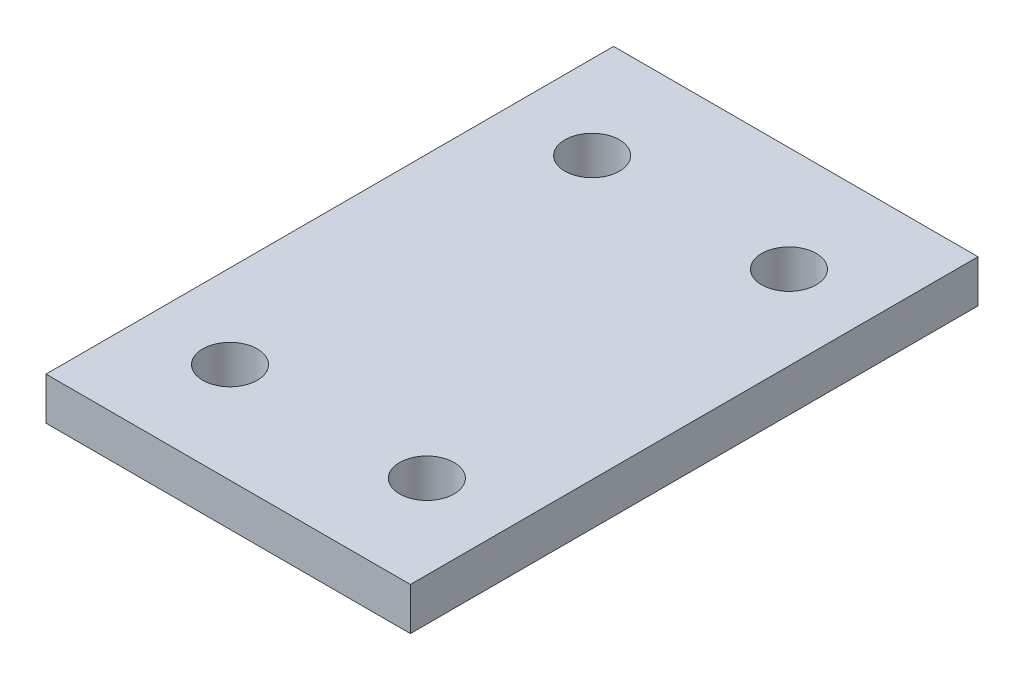
ISO-10303-21;
HEADER;
FILE_DESCRIPTION(('STEP AP214'),'2;1');
FILE_NAME('part.step','',(''),(''),'','','');
FILE_SCHEMA(('AUTOMOTIVE_DESIGN { 1 0 10303 214 1 1 1 1 }'));
ENDSEC;
DATA;
#1=APPLICATION_CONTEXT('core data for automotive mechanical design processes');
#2=APPLICATION_PROTOCOL_DEFINITION('international standard','automotive_design',2000,#1);
#3=PRODUCT_CONTEXT('',#1,'mechanical');
#4=PRODUCT('Part','Part','',(#3));
#5=PRODUCT_RELATED_PRODUCT_CATEGORY('part','',(#4));
#6=PRODUCT_DEFINITION_FORMATION('','',#4);
#7=PRODUCT_DEFINITION_CONTEXT('part definition',#1,'design');
#8=PRODUCT_DEFINITION('design','',#6,#7);
#9=PRODUCT_DEFINITION_SHAPE('','',#8);
#10=(LENGTH_UNIT() NAMED_UNIT(*) SI_UNIT(.MILLI.,.METRE.));
#11=(NAMED_UNIT(*) PLANE_ANGLE_UNIT() SI_UNIT($,.RADIAN.));
#12=(NAMED_UNIT(*) SI_UNIT($,.STERADIAN.) SOLID_ANGLE_UNIT());
#13=UNCERTAINTY_MEASURE_WITH_UNIT(LENGTH_MEASURE(1.E-05),#10,'distance_accuracy_value','');
#14=(GEOMETRIC_REPRESENTATION_CONTEXT(3) GLOBAL_UNCERTAINTY_ASSIGNED_CONTEXT((#13)) GLOBAL_UNIT_ASSIGNED_CONTEXT((#10,
#11,#12)) REPRESENTATION_CONTEXT('',''));
#15=CARTESIAN_POINT('',(0.,0.,0.));
#16=DIRECTION('',(0.,0.,1.));
#17=DIRECTION('',(1.,0.,0.));
#18=AXIS2_PLACEMENT_3D('',#15,#16,#17);
#19=CARTESIAN_POINT('',(20.3835,4.7625,-31.75));
#20=DIRECTION('',(0.,-1.,0.));
#21=DIRECTION('',(0.,0.,-1.));
#22=AXIS2_PLACEMENT_3D('',#19,#20,#21);
#23=PLANE('',#22);
#24=CARTESIAN_POINT('',(-11.0109,4.7625,20.5359000000001));
#25=DIRECTION('',(0.,1.,0.));
#26=DIRECTION('',(0.,0.,-1.));
#27=AXIS2_PLACEMENT_3D('',#24,#25,#26);
#28=CIRCLE('',#27,3.05);
#29=CARTESIAN_POINT('',(-11.0109,4.7625,17.4859));
#30=VERTEX_POINT('',#29);
#31=EDGE_CURVE('E121',#30,#30,#28,.T.);
#32=ORIENTED_EDGE('',*,*,#31,.F.);
#33=EDGE_LOOP('',(#32));
#34=FACE_BOUND('',#33,.T.);
#35=CARTESIAN_POINT('',(11.0109,4.7625,-19.9771));
#36=DIRECTION('',(0.,1.,0.));
#37=DIRECTION('',(0.,0.,1.));
#38=AXIS2_PLACEMENT_3D('',#35,#36,#37);
#39=CIRCLE('',#38,3.05);
#40=CARTESIAN_POINT('',(11.0109,4.7625,-23.0271));
#41=VERTEX_POINT('',#40);
#42=EDGE_CURVE('E100',#41,#41,#39,.T.);
#43=ORIENTED_EDGE('',*,*,#42,.F.);
#44=EDGE_LOOP('',(#43));
#45=FACE_BOUND('',#44,.T.);
#46=DIRECTION('',(0.,0.,-1.));
#47=VECTOR('',#46,1.);
#48=CARTESIAN_POINT('',(20.3835,4.7625,31.75));
#49=LINE('',#48,#47);
#50=CARTESIAN_POINT('',(20.3835,4.7625,31.75));
#51=VERTEX_POINT('',#50);
#52=CARTESIAN_POINT('',(20.3835,4.7625,-31.75));
#53=VERTEX_POINT('',#52);
#54=EDGE_CURVE('E85',#51,#53,#49,.T.);
#55=ORIENTED_EDGE('',*,*,#54,.T.);
#56=DIRECTION('',(-1.,0.,0.));
#57=VECTOR('',#56,1.);
#58=CARTESIAN_POINT('',(-20.3835,4.7625,-31.75));
#59=LINE('',#58,#57);
#60=CARTESIAN_POINT('',(-20.3835,4.7625,-31.75));
#61=VERTEX_POINT('',#60);
#62=EDGE_CURVE('E80',#53,#61,#59,.T.);
#63=ORIENTED_EDGE('',*,*,#62,.T.);
#64=DIRECTION('',(0.,0.,1.));
#65=VECTOR('',#64,1.);
#66=CARTESIAN_POINT('',(-20.3835,4.7625,31.75));
#67=LINE('',#66,#65);
#68=CARTESIAN_POINT('',(-20.3835,4.7625,31.75));
#69=VERTEX_POINT('',#68);
#70=EDGE_CURVE('E83',#61,#69,#67,.T.);
#71=ORIENTED_EDGE('',*,*,#70,.T.);
#72=DIRECTION('',(1.,0.,0.));
#73=VECTOR('',#72,1.);
#74=CARTESIAN_POINT('',(-20.3835,4.7625,31.75));
#75=LINE('',#74,#73);
#76=EDGE_CURVE('E50',#69,#51,#75,.T.);
#77=ORIENTED_EDGE('',*,*,#76,.T.);
#78=EDGE_LOOP('',(#55,#63,#71,#77));
#79=FACE_BOUND('',#78,.T.);
#80=CARTESIAN_POINT('',(11.0109,4.7625,20.5359000000001));
#81=DIRECTION('',(0.,1.,0.));
#82=DIRECTION('',(0.,0.,1.));
#83=AXIS2_PLACEMENT_3D('',#80,#81,#82);
#84=CIRCLE('',#83,3.05);
#85=CARTESIAN_POINT('',(11.0109,4.7625,17.4859));
#86=VERTEX_POINT('',#85);
#87=EDGE_CURVE('E115',#86,#86,#84,.T.);
#88=ORIENTED_EDGE('',*,*,#87,.F.);
#89=EDGE_LOOP('',(#88));
#90=FACE_BOUND('',#89,.T.);
#91=CARTESIAN_POINT('',(-11.0109,4.7625,-19.9771));
#92=DIRECTION('',(0.,1.,0.));
#93=DIRECTION('',(0.,0.,-1.));
#94=AXIS2_PLACEMENT_3D('',#91,#92,#93);
#95=CIRCLE('',#94,3.05);
#96=CARTESIAN_POINT('',(-11.0109,4.7625,-23.0271));
#97=VERTEX_POINT('',#96);
#98=EDGE_CURVE('E127',#97,#97,#95,.T.);
#99=ORIENTED_EDGE('',*,*,#98,.F.);
#100=EDGE_LOOP('',(#99));
#101=FACE_BOUND('',#100,.T.);
#102=ADVANCED_FACE('F33',(#34,#45,#79,#90,#101),#23,.F.);
#103=CARTESIAN_POINT('',(20.3835,0.,-31.75));
#104=DIRECTION('',(0.,-1.,0.));
#105=DIRECTION('',(0.,0.,-1.));
#106=AXIS2_PLACEMENT_3D('',#103,#104,#105);
#107=PLANE('',#106);
#108=CARTESIAN_POINT('',(-11.0109,0.,20.5359000000001));
#109=DIRECTION('',(0.,1.,0.));
#110=DIRECTION('',(0.,0.,-1.));
#111=AXIS2_PLACEMENT_3D('',#108,#109,#110);
#112=CIRCLE('',#111,3.05);
#113=CARTESIAN_POINT('',(-11.0109,0.,17.4859));
#114=VERTEX_POINT('',#113);
#115=EDGE_CURVE('E124',#114,#114,#112,.T.);
#116=ORIENTED_EDGE('',*,*,#115,.T.);
#117=EDGE_LOOP('',(#116));
#118=FACE_BOUND('',#117,.T.);
#119=CARTESIAN_POINT('',(11.0109,0.,-19.9771));
#120=DIRECTION('',(0.,1.,0.));
#121=DIRECTION('',(0.,0.,1.));
#122=AXIS2_PLACEMENT_3D('',#119,#120,#121);
#123=CIRCLE('',#122,3.05);
#124=CARTESIAN_POINT('',(11.0109,0.,-23.0271));
#125=VERTEX_POINT('',#124);
#126=EDGE_CURVE('E112',#125,#125,#123,.T.);
#127=ORIENTED_EDGE('',*,*,#126,.T.);
#128=EDGE_LOOP('',(#127));
#129=FACE_BOUND('',#128,.T.);
#130=DIRECTION('',(0.,0.,-1.));
#131=VECTOR('',#130,1.);
#132=CARTESIAN_POINT('',(20.3835,0.,31.75));
#133=LINE('',#132,#131);
#134=CARTESIAN_POINT('',(20.3835,0.,31.75));
#135=VERTEX_POINT('',#134);
#136=CARTESIAN_POINT('',(20.3835,0.,-31.75));
#137=VERTEX_POINT('',#136);
#138=EDGE_CURVE('E97',#135,#137,#133,.T.);
#139=ORIENTED_EDGE('',*,*,#138,.F.);
#140=DIRECTION('',(1.,0.,0.));
#141=VECTOR('',#140,1.);
#142=CARTESIAN_POINT('',(-20.3835,0.,31.75));
#143=LINE('',#142,#141);
#144=CARTESIAN_POINT('',(-20.3835,0.,31.75));
#145=VERTEX_POINT('',#144);
#146=EDGE_CURVE('E73',#145,#135,#143,.T.);
#147=ORIENTED_EDGE('',*,*,#146,.F.);
#148=DIRECTION('',(0.,0.,1.));
#149=VECTOR('',#148,1.);
#150=CARTESIAN_POINT('',(-20.3835,0.,31.75));
#151=LINE('',#150,#149);
#152=CARTESIAN_POINT('',(-20.3835,0.,-31.75));
#153=VERTEX_POINT('',#152);
#154=EDGE_CURVE('E67',#153,#145,#151,.T.);
#155=ORIENTED_EDGE('',*,*,#154,.F.);
#156=DIRECTION('',(-1.,0.,0.));
#157=VECTOR('',#156,1.);
#158=CARTESIAN_POINT('',(-20.3835,0.,-31.75));
#159=LINE('',#158,#157);
#160=EDGE_CURVE('E89',#137,#153,#159,.T.);
#161=ORIENTED_EDGE('',*,*,#160,.F.);
#162=EDGE_LOOP('',(#139,#147,#155,#161));
#163=FACE_BOUND('',#162,.T.);
#164=CARTESIAN_POINT('',(11.0109,0.,20.5359000000001));
#165=DIRECTION('',(0.,1.,0.));
#166=DIRECTION('',(0.,0.,1.));
#167=AXIS2_PLACEMENT_3D('',#164,#165,#166);
#168=CIRCLE('',#167,3.05);
#169=CARTESIAN_POINT('',(11.0109,0.,17.4859));
#170=VERTEX_POINT('',#169);
#171=EDGE_CURVE('E118',#170,#170,#168,.T.);
#172=ORIENTED_EDGE('',*,*,#171,.T.);
#173=EDGE_LOOP('',(#172));
#174=FACE_BOUND('',#173,.T.);
#175=CARTESIAN_POINT('',(-11.0109,0.,-19.9771));
#176=DIRECTION('',(0.,1.,0.));
#177=DIRECTION('',(0.,0.,-1.));
#178=AXIS2_PLACEMENT_3D('',#175,#176,#177);
#179=CIRCLE('',#178,3.05);
#180=CARTESIAN_POINT('',(-11.0109,0.,-23.0271));
#181=VERTEX_POINT('',#180);
#182=EDGE_CURVE('E130',#181,#181,#179,.T.);
#183=ORIENTED_EDGE('',*,*,#182,.T.);
#184=EDGE_LOOP('',(#183));
#185=FACE_BOUND('',#184,.T.);
#186=ADVANCED_FACE('F108',(#118,#129,#163,#174,#185),#107,.T.);
#187=CARTESIAN_POINT('',(20.3835,4.7625,31.75));
#188=DIRECTION('',(-1.,0.,0.));
#189=DIRECTION('',(0.,0.,1.));
#190=AXIS2_PLACEMENT_3D('',#187,#188,#189);
#191=PLANE('',#190);
#192=ORIENTED_EDGE('',*,*,#138,.T.);
#193=DIRECTION('',(0.,-1.,0.));
#194=VECTOR('',#193,1.);
#195=CARTESIAN_POINT('',(20.3835,4.7625,-31.75));
#196=LINE('',#195,#194);
#197=EDGE_CURVE('E11',#53,#137,#196,.T.);
#198=ORIENTED_EDGE('',*,*,#197,.F.);
#199=ORIENTED_EDGE('',*,*,#54,.F.);
#200=DIRECTION('',(0.,-1.,0.));
#201=VECTOR('',#200,1.);
#202=CARTESIAN_POINT('',(20.3835,4.7625,31.75));
#203=LINE('',#202,#201);
#204=EDGE_CURVE('E93',#51,#135,#203,.T.);
#205=ORIENTED_EDGE('',*,*,#204,.T.);
#206=EDGE_LOOP('',(#192,#198,#199,#205));
#207=FACE_BOUND('',#206,.T.);
#208=ADVANCED_FACE('F35',(#207),#191,.F.);
#209=CARTESIAN_POINT('',(-20.3835,4.7625,-31.75));
#210=DIRECTION('',(0.,0.,1.));
#211=DIRECTION('',(1.,0.,0.));
#212=AXIS2_PLACEMENT_3D('',#209,#210,#211);
#213=PLANE('',#212);
#214=ORIENTED_EDGE('',*,*,#160,.T.);
#215=DIRECTION('',(0.,-1.,0.));
#216=VECTOR('',#215,1.);
#217=CARTESIAN_POINT('',(-20.3835,4.7625,-31.75));
#218=LINE('',#217,#216);
#219=EDGE_CURVE('E42',#61,#153,#218,.T.);
#220=ORIENTED_EDGE('',*,*,#219,.F.);
#221=ORIENTED_EDGE('',*,*,#62,.F.);
#222=ORIENTED_EDGE('',*,*,#197,.T.);
#223=EDGE_LOOP('',(#214,#220,#221,#222));
#224=FACE_BOUND('',#223,.T.);
#225=ADVANCED_FACE('F88',(#224),#213,.F.);
#226=CARTESIAN_POINT('',(-20.3835,4.7625,31.75));
#227=DIRECTION('',(1.,0.,0.));
#228=DIRECTION('',(0.,0.,-1.));
#229=AXIS2_PLACEMENT_3D('',#226,#227,#228);
#230=PLANE('',#229);
#231=ORIENTED_EDGE('',*,*,#154,.T.);
#232=DIRECTION('',(0.,-1.,0.));
#233=VECTOR('',#232,1.);
#234=CARTESIAN_POINT('',(-20.3835,4.7625,31.75));
#235=LINE('',#234,#233);
#236=EDGE_CURVE('E90',#69,#145,#235,.T.);
#237=ORIENTED_EDGE('',*,*,#236,.F.);
#238=ORIENTED_EDGE('',*,*,#70,.F.);
#239=ORIENTED_EDGE('',*,*,#219,.T.);
#240=EDGE_LOOP('',(#231,#237,#238,#239));
#241=FACE_BOUND('',#240,.T.);
#242=ADVANCED_FACE('F91',(#241),#230,.F.);
#243=CARTESIAN_POINT('',(-20.3835,4.7625,31.75));
#244=DIRECTION('',(0.,0.,-1.));
#245=DIRECTION('',(-1.,0.,0.));
#246=AXIS2_PLACEMENT_3D('',#243,#244,#245);
#247=PLANE('',#246);
#248=ORIENTED_EDGE('',*,*,#146,.T.);
#249=ORIENTED_EDGE('',*,*,#204,.F.);
#250=ORIENTED_EDGE('',*,*,#76,.F.);
#251=ORIENTED_EDGE('',*,*,#236,.T.);
#252=EDGE_LOOP('',(#248,#249,#250,#251));
#253=FACE_BOUND('',#252,.T.);
#254=ADVANCED_FACE('F105',(#253),#247,.F.);
#255=CARTESIAN_POINT('',(11.0109,4.7625,-19.9771));
#256=DIRECTION('',(0.,-1.,0.));
#257=DIRECTION('',(0.,0.,-1.));
#258=AXIS2_PLACEMENT_3D('',#255,#256,#257);
#259=CYLINDRICAL_SURFACE('',#258,3.05);
#260=CARTESIAN_POINT('',(11.0109,4.7625,-23.0271));
#261=CARTESIAN_POINT('',(11.0109,4.712890625,-23.0271));
#262=CARTESIAN_POINT('',(11.0109,4.66328125,-23.0271));
#263=CARTESIAN_POINT('',(11.0109,4.5640625,-23.0271));
#264=CARTESIAN_POINT('',(11.0109,4.514453125,-23.0271));
#265=CARTESIAN_POINT('',(11.0109,4.415234375,-23.0271));
#266=CARTESIAN_POINT('',(11.0109,4.365625,-23.0271));
#267=CARTESIAN_POINT('',(11.0109,4.26640625,-23.0271));
#268=CARTESIAN_POINT('',(11.0109,4.216796875,-23.0271));
#269=CARTESIAN_POINT('',(11.0109,4.117578125,-23.0271));
#270=CARTESIAN_POINT('',(11.0109,4.06796875,-23.0271));
#271=CARTESIAN_POINT('',(11.0109,3.96875,-23.0271));
#272=CARTESIAN_POINT('',(11.0109,3.919140625,-23.0271));
#273=CARTESIAN_POINT('',(11.0109,3.819921875,-23.0271));
#274=CARTESIAN_POINT('',(11.0109,3.7703125,-23.0271));
#275=CARTESIAN_POINT('',(11.0109,3.67109375,-23.0271));
#276=CARTESIAN_POINT('',(11.0109,3.621484375,-23.0271));
#277=CARTESIAN_POINT('',(11.0109,3.522265625,-23.0271));
#278=CARTESIAN_POINT('',(11.0109,3.47265625,-23.0271));
#279=CARTESIAN_POINT('',(11.0109,3.3734375,-23.0271));
#280=CARTESIAN_POINT('',(11.0109,3.323828125,-23.0271));
#281=CARTESIAN_POINT('',(11.0109,3.224609375,-23.0271));
#282=CARTESIAN_POINT('',(11.0109,3.175,-23.0271));
#283=CARTESIAN_POINT('',(11.0109,3.07578125,-23.0271));
#284=CARTESIAN_POINT('',(11.0109,3.026171875,-23.0271));
#285=CARTESIAN_POINT('',(11.0109,2.926953125,-23.0271));
#286=CARTESIAN_POINT('',(11.0109,2.87734375,-23.0271));
#287=CARTESIAN_POINT('',(11.0109,2.778125,-23.0271));
#288=CARTESIAN_POINT('',(11.0109,2.728515625,-23.0271));
#289=CARTESIAN_POINT('',(11.0109,2.629296875,-23.0271));
#290=CARTESIAN_POINT('',(11.0109,2.5796875,-23.0271));
#291=CARTESIAN_POINT('',(11.0109,2.48046875,-23.0271));
#292=CARTESIAN_POINT('',(11.0109,2.430859375,-23.0271));
#293=CARTESIAN_POINT('',(11.0109,2.331640625,-23.0271));
#294=CARTESIAN_POINT('',(11.0109,2.28203125,-23.0271));
#295=CARTESIAN_POINT('',(11.0109,2.1828125,-23.0271));
#296=CARTESIAN_POINT('',(11.0109,2.133203125,-23.0271));
#297=CARTESIAN_POINT('',(11.0109,2.033984375,-23.0271));
#298=CARTESIAN_POINT('',(11.0109,1.984375,-23.0271));
#299=CARTESIAN_POINT('',(11.0109,1.88515625,-23.0271));
#300=CARTESIAN_POINT('',(11.0109,1.835546875,-23.0271));
#301=CARTESIAN_POINT('',(11.0109,1.736328125,-23.0271));
#302=CARTESIAN_POINT('',(11.0109,1.68671875,-23.0271));
#303=CARTESIAN_POINT('',(11.0109,1.5875,-23.0271));
#304=CARTESIAN_POINT('',(11.0109,1.537890625,-23.0271));
#305=CARTESIAN_POINT('',(11.0109,1.438671875,-23.0271));
#306=CARTESIAN_POINT('',(11.0109,1.3890625,-23.0271));
#307=CARTESIAN_POINT('',(11.0109,1.28984375,-23.0271));
#308=CARTESIAN_POINT('',(11.0109,1.240234375,-23.0271));
#309=CARTESIAN_POINT('',(11.0109,1.141015625,-23.0271));
#310=CARTESIAN_POINT('',(11.0109,1.09140625,-23.0271));
#311=CARTESIAN_POINT('',(11.0109,0.9921875,-23.0271));
#312=CARTESIAN_POINT('',(11.0109,0.942578125,-23.0271));
#313=CARTESIAN_POINT('',(11.0109,0.843359375,-23.0271));
#314=CARTESIAN_POINT('',(11.0109,0.79375,-23.0271));
#315=CARTESIAN_POINT('',(11.0109,0.69453125,-23.0271));
#316=CARTESIAN_POINT('',(11.0109,0.644921875,-23.0271));
#317=CARTESIAN_POINT('',(11.0109,0.545703125,-23.0271));
#318=CARTESIAN_POINT('',(11.0109,0.49609375,-23.0271));
#319=CARTESIAN_POINT('',(11.0109,0.396875,-23.0271));
#320=CARTESIAN_POINT('',(11.0109,0.347265625,-23.0271));
#321=CARTESIAN_POINT('',(11.0109,0.248046875,-23.0271));
#322=CARTESIAN_POINT('',(11.0109,0.1984375,-23.0271));
#323=CARTESIAN_POINT('',(11.0109,0.09921875,-23.0271));
#324=CARTESIAN_POINT('',(11.0109,0.049609375,-23.0271));
#325=CARTESIAN_POINT('',(11.0109,0.,-23.0271));
#326=B_SPLINE_CURVE_WITH_KNOTS('',3,(#260,#261,#262,#263,#264,#265,#266,#267,#268,#269,#270,
#271,#272,#273,#274,#275,#276,#277,#278,#279,#280,#281,#282,#283,#284,#285,#286,#287,#288,#289,
#290,#291,#292,#293,#294,#295,#296,#297,#298,#299,#300,#301,#302,#303,#304,#305,#306,#307,#308,
#309,#310,#311,#312,#313,#314,#315,#316,#317,#318,#319,#320,#321,#322,#323,#324,#325),
.UNSPECIFIED.,.F.,.F.,(4,2,2,2,2,2,2,2,2,2,2,2,2,2,2,2,2,2,2,2,2,2,2,2,2,2,2,2,2,2,2,2,4),(0.,
0.148828124999999,0.297656249999999,0.446484374999999,0.595312499999999,0.744140625,0.89296875,
1.041796875,1.190625,1.339453125,1.48828125,1.637109375,1.7859375,1.934765625,2.08359375,
2.232421875,2.38125,2.530078125,2.67890625,2.827734375,2.9765625,3.125390625,3.27421875,
3.423046875,3.571875,3.720703125,3.86953125,4.018359375,4.1671875,4.316015625,4.46484375,
4.613671875,4.7625),.UNSPECIFIED.);
#327=EDGE_CURVE('BSEAM150',#41,#125,#326,.T.);
#328=ORIENTED_EDGE('',*,*,#42,.T.);
#329=ORIENTED_EDGE('',*,*,#126,.F.);
#330=ORIENTED_EDGE('',*,*,#327,.T.);
#331=ORIENTED_EDGE('',*,*,#327,.F.);
#332=EDGE_LOOP('',(#328,#330,#329,#331));
#333=FACE_BOUND('',#332,.T.);
#334=ADVANCED_FACE('F150',(#333),#259,.F.);
#335=CARTESIAN_POINT('',(11.0109,4.7625,20.5359000000001));
#336=DIRECTION('',(0.,-1.,0.));
#337=DIRECTION('',(0.,0.,-1.));
#338=AXIS2_PLACEMENT_3D('',#335,#336,#337);
#339=CYLINDRICAL_SURFACE('',#338,3.05);
#340=CARTESIAN_POINT('',(11.0109,4.7625,17.4859));
#341=CARTESIAN_POINT('',(11.0109,4.712890625,17.4859));
#342=CARTESIAN_POINT('',(11.0109,4.66328125,17.4859));
#343=CARTESIAN_POINT('',(11.0109,4.5640625,17.4859));
#344=CARTESIAN_POINT('',(11.0109,4.514453125,17.4859));
#345=CARTESIAN_POINT('',(11.0109,4.415234375,17.4859));
#346=CARTESIAN_POINT('',(11.0109,4.365625,17.4859));
#347=CARTESIAN_POINT('',(11.0109,4.26640625,17.4859));
#348=CARTESIAN_POINT('',(11.0109,4.216796875,17.4859));
#349=CARTESIAN_POINT('',(11.0109,4.117578125,17.4859));
#350=CARTESIAN_POINT('',(11.0109,4.06796875,17.4859));
#351=CARTESIAN_POINT('',(11.0109,3.96875,17.4859));
#352=CARTESIAN_POINT('',(11.0109,3.919140625,17.4859));
#353=CARTESIAN_POINT('',(11.0109,3.819921875,17.4859));
#354=CARTESIAN_POINT('',(11.0109,3.7703125,17.4859));
#355=CARTESIAN_POINT('',(11.0109,3.67109375,17.4859));
#356=CARTESIAN_POINT('',(11.0109,3.621484375,17.4859));
#357=CARTESIAN_POINT('',(11.0109,3.522265625,17.4859));
#358=CARTESIAN_POINT('',(11.0109,3.47265625,17.4859));
#359=CARTESIAN_POINT('',(11.0109,3.3734375,17.4859));
#360=CARTESIAN_POINT('',(11.0109,3.323828125,17.4859));
#361=CARTESIAN_POINT('',(11.0109,3.224609375,17.4859));
#362=CARTESIAN_POINT('',(11.0109,3.175,17.4859));
#363=CARTESIAN_POINT('',(11.0109,3.07578125,17.4859));
#364=CARTESIAN_POINT('',(11.0109,3.026171875,17.4859));
#365=CARTESIAN_POINT('',(11.0109,2.926953125,17.4859));
#366=CARTESIAN_POINT('',(11.0109,2.87734375,17.4859));
#367=CARTESIAN_POINT('',(11.0109,2.778125,17.4859));
#368=CARTESIAN_POINT('',(11.0109,2.728515625,17.4859));
#369=CARTESIAN_POINT('',(11.0109,2.629296875,17.4859));
#370=CARTESIAN_POINT('',(11.0109,2.5796875,17.4859));
#371=CARTESIAN_POINT('',(11.0109,2.48046875,17.4859));
#372=CARTESIAN_POINT('',(11.0109,2.430859375,17.4859));
#373=CARTESIAN_POINT('',(11.0109,2.331640625,17.4859));
#374=CARTESIAN_POINT('',(11.0109,2.28203125,17.4859));
#375=CARTESIAN_POINT('',(11.0109,2.1828125,17.4859));
#376=CARTESIAN_POINT('',(11.0109,2.133203125,17.4859));
#377=CARTESIAN_POINT('',(11.0109,2.033984375,17.4859));
#378=CARTESIAN_POINT('',(11.0109,1.984375,17.4859));
#379=CARTESIAN_POINT('',(11.0109,1.88515625,17.4859));
#380=CARTESIAN_POINT('',(11.0109,1.835546875,17.4859));
#381=CARTESIAN_POINT('',(11.0109,1.736328125,17.4859));
#382=CARTESIAN_POINT('',(11.0109,1.68671875,17.4859));
#383=CARTESIAN_POINT('',(11.0109,1.5875,17.4859));
#384=CARTESIAN_POINT('',(11.0109,1.537890625,17.4859));
#385=CARTESIAN_POINT('',(11.0109,1.438671875,17.4859));
#386=CARTESIAN_POINT('',(11.0109,1.3890625,17.4859));
#387=CARTESIAN_POINT('',(11.0109,1.28984375,17.4859));
#388=CARTESIAN_POINT('',(11.0109,1.240234375,17.4859));
#389=CARTESIAN_POINT('',(11.0109,1.141015625,17.4859));
#390=CARTESIAN_POINT('',(11.0109,1.09140625,17.4859));
#391=CARTESIAN_POINT('',(11.0109,0.9921875,17.4859));
#392=CARTESIAN_POINT('',(11.0109,0.942578125,17.4859));
#393=CARTESIAN_POINT('',(11.0109,0.843359375,17.4859));
#394=CARTESIAN_POINT('',(11.0109,0.79375,17.4859));
#395=CARTESIAN_POINT('',(11.0109,0.69453125,17.4859));
#396=CARTESIAN_POINT('',(11.0109,0.644921875,17.4859));
#397=CARTESIAN_POINT('',(11.0109,0.545703125,17.4859));
#398=CARTESIAN_POINT('',(11.0109,0.49609375,17.4859));
#399=CARTESIAN_POINT('',(11.0109,0.396875,17.4859));
#400=CARTESIAN_POINT('',(11.0109,0.347265625,17.4859));
#401=CARTESIAN_POINT('',(11.0109,0.248046875,17.4859));
#402=CARTESIAN_POINT('',(11.0109,0.1984375,17.4859));
#403=CARTESIAN_POINT('',(11.0109,0.09921875,17.4859));
#404=CARTESIAN_POINT('',(11.0109,0.049609375,17.4859));
#405=CARTESIAN_POINT('',(11.0109,0.,17.4859));
#406=B_SPLINE_CURVE_WITH_KNOTS('',3,(#340,#341,#342,#343,#344,#345,#346,#347,#348,#349,#350,
#351,#352,#353,#354,#355,#356,#357,#358,#359,#360,#361,#362,#363,#364,#365,#366,#367,#368,#369,
#370,#371,#372,#373,#374,#375,#376,#377,#378,#379,#380,#381,#382,#383,#384,#385,#386,#387,#388,
#389,#390,#391,#392,#393,#394,#395,#396,#397,#398,#399,#400,#401,#402,#403,#404,#405),
.UNSPECIFIED.,.F.,.F.,(4,2,2,2,2,2,2,2,2,2,2,2,2,2,2,2,2,2,2,2,2,2,2,2,2,2,2,2,2,2,2,2,4),(0.,
0.148828124999999,0.297656249999999,0.446484374999999,0.595312499999999,0.744140625,0.89296875,
1.041796875,1.190625,1.339453125,1.48828125,1.637109375,1.7859375,1.934765625,2.08359375,
2.232421875,2.38125,2.530078125,2.67890625,2.827734375,2.9765625,3.125390625,3.27421875,
3.423046875,3.571875,3.720703125,3.86953125,4.018359375,4.1671875,4.316015625,4.46484375,
4.613671875,4.7625),.UNSPECIFIED.);
#407=EDGE_CURVE('BSEAM196',#86,#170,#406,.T.);
#408=ORIENTED_EDGE('',*,*,#87,.T.);
#409=ORIENTED_EDGE('',*,*,#171,.F.);
#410=ORIENTED_EDGE('',*,*,#407,.T.);
#411=ORIENTED_EDGE('',*,*,#407,.F.);
#412=EDGE_LOOP('',(#408,#410,#409,#411));
#413=FACE_BOUND('',#412,.T.);
#414=ADVANCED_FACE('F196',(#413),#339,.F.);
#415=CARTESIAN_POINT('',(-11.0109,4.7625,20.5359000000001));
#416=DIRECTION('',(0.,-1.,0.));
#417=DIRECTION('',(0.,0.,-1.));
#418=AXIS2_PLACEMENT_3D('',#415,#416,#417);
#419=CYLINDRICAL_SURFACE('',#418,3.05);
#420=CARTESIAN_POINT('',(-11.0109,4.7625,17.4859));
#421=CARTESIAN_POINT('',(-11.0109,4.712890625,17.4859));
#422=CARTESIAN_POINT('',(-11.0109,4.66328125,17.4859));
#423=CARTESIAN_POINT('',(-11.0109,4.5640625,17.4859));
#424=CARTESIAN_POINT('',(-11.0109,4.514453125,17.4859));
#425=CARTESIAN_POINT('',(-11.0109,4.415234375,17.4859));
#426=CARTESIAN_POINT('',(-11.0109,4.365625,17.4859));
#427=CARTESIAN_POINT('',(-11.0109,4.26640625,17.4859));
#428=CARTESIAN_POINT('',(-11.0109,4.216796875,17.4859));
#429=CARTESIAN_POINT('',(-11.0109,4.117578125,17.4859));
#430=CARTESIAN_POINT('',(-11.0109,4.06796875,17.4859));
#431=CARTESIAN_POINT('',(-11.0109,3.96875,17.4859));
#432=CARTESIAN_POINT('',(-11.0109,3.919140625,17.4859));
#433=CARTESIAN_POINT('',(-11.0109,3.819921875,17.4859));
#434=CARTESIAN_POINT('',(-11.0109,3.7703125,17.4859));
#435=CARTESIAN_POINT('',(-11.0109,3.67109375,17.4859));
#436=CARTESIAN_POINT('',(-11.0109,3.621484375,17.4859));
#437=CARTESIAN_POINT('',(-11.0109,3.522265625,17.4859));
#438=CARTESIAN_POINT('',(-11.0109,3.47265625,17.4859));
#439=CARTESIAN_POINT('',(-11.0109,3.3734375,17.4859));
#440=CARTESIAN_POINT('',(-11.0109,3.323828125,17.4859));
#441=CARTESIAN_POINT('',(-11.0109,3.224609375,17.4859));
#442=CARTESIAN_POINT('',(-11.0109,3.175,17.4859));
#443=CARTESIAN_POINT('',(-11.0109,3.07578125,17.4859));
#444=CARTESIAN_POINT('',(-11.0109,3.026171875,17.4859));
#445=CARTESIAN_POINT('',(-11.0109,2.926953125,17.4859));
#446=CARTESIAN_POINT('',(-11.0109,2.87734375,17.4859));
#447=CARTESIAN_POINT('',(-11.0109,2.778125,17.4859));
#448=CARTESIAN_POINT('',(-11.0109,2.728515625,17.4859));
#449=CARTESIAN_POINT('',(-11.0109,2.629296875,17.4859));
#450=CARTESIAN_POINT('',(-11.0109,2.5796875,17.4859));
#451=CARTESIAN_POINT('',(-11.0109,2.48046875,17.4859));
#452=CARTESIAN_POINT('',(-11.0109,2.430859375,17.4859));
#453=CARTESIAN_POINT('',(-11.0109,2.331640625,17.4859));
#454=CARTESIAN_POINT('',(-11.0109,2.28203125,17.4859));
#455=CARTESIAN_POINT('',(-11.0109,2.1828125,17.4859));
#456=CARTESIAN_POINT('',(-11.0109,2.133203125,17.4859));
#457=CARTESIAN_POINT('',(-11.0109,2.033984375,17.4859));
#458=CARTESIAN_POINT('',(-11.0109,1.984375,17.4859));
#459=CARTESIAN_POINT('',(-11.0109,1.88515625,17.4859));
#460=CARTESIAN_POINT('',(-11.0109,1.835546875,17.4859));
#461=CARTESIAN_POINT('',(-11.0109,1.736328125,17.4859));
#462=CARTESIAN_POINT('',(-11.0109,1.68671875,17.4859));
#463=CARTESIAN_POINT('',(-11.0109,1.5875,17.4859));
#464=CARTESIAN_POINT('',(-11.0109,1.537890625,17.4859));
#465=CARTESIAN_POINT('',(-11.0109,1.438671875,17.4859));
#466=CARTESIAN_POINT('',(-11.0109,1.3890625,17.4859));
#467=CARTESIAN_POINT('',(-11.0109,1.28984375,17.4859));
#468=CARTESIAN_POINT('',(-11.0109,1.240234375,17.4859));
#469=CARTESIAN_POINT('',(-11.0109,1.141015625,17.4859));
#470=CARTESIAN_POINT('',(-11.0109,1.09140625,17.4859));
#471=CARTESIAN_POINT('',(-11.0109,0.9921875,17.4859));
#472=CARTESIAN_POINT('',(-11.0109,0.942578125,17.4859));
#473=CARTESIAN_POINT('',(-11.0109,0.843359375,17.4859));
#474=CARTESIAN_POINT('',(-11.0109,0.79375,17.4859));
#475=CARTESIAN_POINT('',(-11.0109,0.69453125,17.4859));
#476=CARTESIAN_POINT('',(-11.0109,0.644921875,17.4859));
#477=CARTESIAN_POINT('',(-11.0109,0.545703125,17.4859));
#478=CARTESIAN_POINT('',(-11.0109,0.49609375,17.4859));
#479=CARTESIAN_POINT('',(-11.0109,0.396875,17.4859));
#480=CARTESIAN_POINT('',(-11.0109,0.347265625,17.4859));
#481=CARTESIAN_POINT('',(-11.0109,0.248046875,17.4859));
#482=CARTESIAN_POINT('',(-11.0109,0.1984375,17.4859));
#483=CARTESIAN_POINT('',(-11.0109,0.09921875,17.4859));
#484=CARTESIAN_POINT('',(-11.0109,0.049609375,17.4859));
#485=CARTESIAN_POINT('',(-11.0109,0.,17.4859));
#486=B_SPLINE_CURVE_WITH_KNOTS('',3,(#420,#421,#422,#423,#424,#425,#426,#427,#428,#429,#430,
#431,#432,#433,#434,#435,#436,#437,#438,#439,#440,#441,#442,#443,#444,#445,#446,#447,#448,#449,
#450,#451,#452,#453,#454,#455,#456,#457,#458,#459,#460,#461,#462,#463,#464,#465,#466,#467,#468,
#469,#470,#471,#472,#473,#474,#475,#476,#477,#478,#479,#480,#481,#482,#483,#484,#485),
.UNSPECIFIED.,.F.,.F.,(4,2,2,2,2,2,2,2,2,2,2,2,2,2,2,2,2,2,2,2,2,2,2,2,2,2,2,2,2,2,2,2,4),(0.,
0.148828124999999,0.297656249999999,0.446484374999999,0.595312499999999,0.744140625,0.89296875,
1.041796875,1.190625,1.339453125,1.48828125,1.637109375,1.7859375,1.934765625,2.08359375,
2.232421875,2.38125,2.530078125,2.67890625,2.827734375,2.9765625,3.125390625,3.27421875,
3.423046875,3.571875,3.720703125,3.86953125,4.018359375,4.1671875,4.316015625,4.46484375,
4.613671875,4.7625),.UNSPECIFIED.);
#487=EDGE_CURVE('BSEAM204',#30,#114,#486,.T.);
#488=ORIENTED_EDGE('',*,*,#31,.T.);
#489=ORIENTED_EDGE('',*,*,#115,.F.);
#490=ORIENTED_EDGE('',*,*,#487,.T.);
#491=ORIENTED_EDGE('',*,*,#487,.F.);
#492=EDGE_LOOP('',(#488,#490,#489,#491));
#493=FACE_BOUND('',#492,.T.);
#494=ADVANCED_FACE('F204',(#493),#419,.F.);
#495=CARTESIAN_POINT('',(-11.0109,4.7625,-19.9771));
#496=DIRECTION('',(0.,-1.,0.));
#497=DIRECTION('',(0.,0.,-1.));
#498=AXIS2_PLACEMENT_3D('',#495,#496,#497);
#499=CYLINDRICAL_SURFACE('',#498,3.05);
#500=CARTESIAN_POINT('',(-11.0109,4.7625,-23.0271));
#501=CARTESIAN_POINT('',(-11.0109,4.712890625,-23.0271));
#502=CARTESIAN_POINT('',(-11.0109,4.66328125,-23.0271));
#503=CARTESIAN_POINT('',(-11.0109,4.5640625,-23.0271));
#504=CARTESIAN_POINT('',(-11.0109,4.514453125,-23.0271));
#505=CARTESIAN_POINT('',(-11.0109,4.415234375,-23.0271));
#506=CARTESIAN_POINT('',(-11.0109,4.365625,-23.0271));
#507=CARTESIAN_POINT('',(-11.0109,4.26640625,-23.0271));
#508=CARTESIAN_POINT('',(-11.0109,4.216796875,-23.0271));
#509=CARTESIAN_POINT('',(-11.0109,4.117578125,-23.0271));
#510=CARTESIAN_POINT('',(-11.0109,4.06796875,-23.0271));
#511=CARTESIAN_POINT('',(-11.0109,3.96875,-23.0271));
#512=CARTESIAN_POINT('',(-11.0109,3.919140625,-23.0271));
#513=CARTESIAN_POINT('',(-11.0109,3.819921875,-23.0271));
#514=CARTESIAN_POINT('',(-11.0109,3.7703125,-23.0271));
#515=CARTESIAN_POINT('',(-11.0109,3.67109375,-23.0271));
#516=CARTESIAN_POINT('',(-11.0109,3.621484375,-23.0271));
#517=CARTESIAN_POINT('',(-11.0109,3.522265625,-23.0271));
#518=CARTESIAN_POINT('',(-11.0109,3.47265625,-23.0271));
#519=CARTESIAN_POINT('',(-11.0109,3.3734375,-23.0271));
#520=CARTESIAN_POINT('',(-11.0109,3.323828125,-23.0271));
#521=CARTESIAN_POINT('',(-11.0109,3.224609375,-23.0271));
#522=CARTESIAN_POINT('',(-11.0109,3.175,-23.0271));
#523=CARTESIAN_POINT('',(-11.0109,3.07578125,-23.0271));
#524=CARTESIAN_POINT('',(-11.0109,3.026171875,-23.0271));
#525=CARTESIAN_POINT('',(-11.0109,2.926953125,-23.0271));
#526=CARTESIAN_POINT('',(-11.0109,2.87734375,-23.0271));
#527=CARTESIAN_POINT('',(-11.0109,2.778125,-23.0271));
#528=CARTESIAN_POINT('',(-11.0109,2.728515625,-23.0271));
#529=CARTESIAN_POINT('',(-11.0109,2.629296875,-23.0271));
#530=CARTESIAN_POINT('',(-11.0109,2.5796875,-23.0271));
#531=CARTESIAN_POINT('',(-11.0109,2.48046875,-23.0271));
#532=CARTESIAN_POINT('',(-11.0109,2.430859375,-23.0271));
#533=CARTESIAN_POINT('',(-11.0109,2.331640625,-23.0271));
#534=CARTESIAN_POINT('',(-11.0109,2.28203125,-23.0271));
#535=CARTESIAN_POINT('',(-11.0109,2.1828125,-23.0271));
#536=CARTESIAN_POINT('',(-11.0109,2.133203125,-23.0271));
#537=CARTESIAN_POINT('',(-11.0109,2.033984375,-23.0271));
#538=CARTESIAN_POINT('',(-11.0109,1.984375,-23.0271));
#539=CARTESIAN_POINT('',(-11.0109,1.88515625,-23.0271));
#540=CARTESIAN_POINT('',(-11.0109,1.835546875,-23.0271));
#541=CARTESIAN_POINT('',(-11.0109,1.736328125,-23.0271));
#542=CARTESIAN_POINT('',(-11.0109,1.68671875,-23.0271));
#543=CARTESIAN_POINT('',(-11.0109,1.5875,-23.0271));
#544=CARTESIAN_POINT('',(-11.0109,1.537890625,-23.0271));
#545=CARTESIAN_POINT('',(-11.0109,1.438671875,-23.0271));
#546=CARTESIAN_POINT('',(-11.0109,1.3890625,-23.0271));
#547=CARTESIAN_POINT('',(-11.0109,1.28984375,-23.0271));
#548=CARTESIAN_POINT('',(-11.0109,1.240234375,-23.0271));
#549=CARTESIAN_POINT('',(-11.0109,1.141015625,-23.0271));
#550=CARTESIAN_POINT('',(-11.0109,1.09140625,-23.0271));
#551=CARTESIAN_POINT('',(-11.0109,0.9921875,-23.0271));
#552=CARTESIAN_POINT('',(-11.0109,0.942578125,-23.0271));
#553=CARTESIAN_POINT('',(-11.0109,0.843359375,-23.0271));
#554=CARTESIAN_POINT('',(-11.0109,0.79375,-23.0271));
#555=CARTESIAN_POINT('',(-11.0109,0.69453125,-23.0271));
#556=CARTESIAN_POINT('',(-11.0109,0.644921875,-23.0271));
#557=CARTESIAN_POINT('',(-11.0109,0.545703125,-23.0271));
#558=CARTESIAN_POINT('',(-11.0109,0.49609375,-23.0271));
#559=CARTESIAN_POINT('',(-11.0109,0.396875,-23.0271));
#560=CARTESIAN_POINT('',(-11.0109,0.347265625,-23.0271));
#561=CARTESIAN_POINT('',(-11.0109,0.248046875,-23.0271));
#562=CARTESIAN_POINT('',(-11.0109,0.1984375,-23.0271));
#563=CARTESIAN_POINT('',(-11.0109,0.09921875,-23.0271));
#564=CARTESIAN_POINT('',(-11.0109,0.049609375,-23.0271));
#565=CARTESIAN_POINT('',(-11.0109,0.,-23.0271));
#566=B_SPLINE_CURVE_WITH_KNOTS('',3,(#500,#501,#502,#503,#504,#505,#506,#507,#508,#509,#510,
#511,#512,#513,#514,#515,#516,#517,#518,#519,#520,#521,#522,#523,#524,#525,#526,#527,#528,#529,
#530,#531,#532,#533,#534,#535,#536,#537,#538,#539,#540,#541,#542,#543,#544,#545,#546,#547,#548,
#549,#550,#551,#552,#553,#554,#555,#556,#557,#558,#559,#560,#561,#562,#563,#564,#565),
.UNSPECIFIED.,.F.,.F.,(4,2,2,2,2,2,2,2,2,2,2,2,2,2,2,2,2,2,2,2,2,2,2,2,2,2,2,2,2,2,2,2,4),(0.,
0.148828124999999,0.297656249999999,0.446484374999999,0.595312499999999,0.744140625,0.89296875,
1.041796875,1.190625,1.339453125,1.48828125,1.637109375,1.7859375,1.934765625,2.08359375,
2.232421875,2.38125,2.530078125,2.67890625,2.827734375,2.9765625,3.125390625,3.27421875,
3.423046875,3.571875,3.720703125,3.86953125,4.018359375,4.1671875,4.316015625,4.46484375,
4.613671875,4.7625),.UNSPECIFIED.);
#567=EDGE_CURVE('BSEAM136',#97,#181,#566,.T.);
#568=ORIENTED_EDGE('',*,*,#98,.T.);
#569=ORIENTED_EDGE('',*,*,#182,.F.);
#570=ORIENTED_EDGE('',*,*,#567,.T.);
#571=ORIENTED_EDGE('',*,*,#567,.F.);
#572=EDGE_LOOP('',(#568,#570,#569,#571));
#573=FACE_BOUND('',#572,.T.);
#574=ADVANCED_FACE('F136',(#573),#499,.F.);
#575=CLOSED_SHELL('',(#102,#186,#208,#225,#242,#254,#334,#414,#494,#574));
#576=MANIFOLD_SOLID_BREP('B2',#575);
#577=ADVANCED_BREP_SHAPE_REPRESENTATION('',(#18,#576),#14);
#578=SHAPE_DEFINITION_REPRESENTATION(#9,#577);
ENDSEC;
END-ISO-10303-21;
